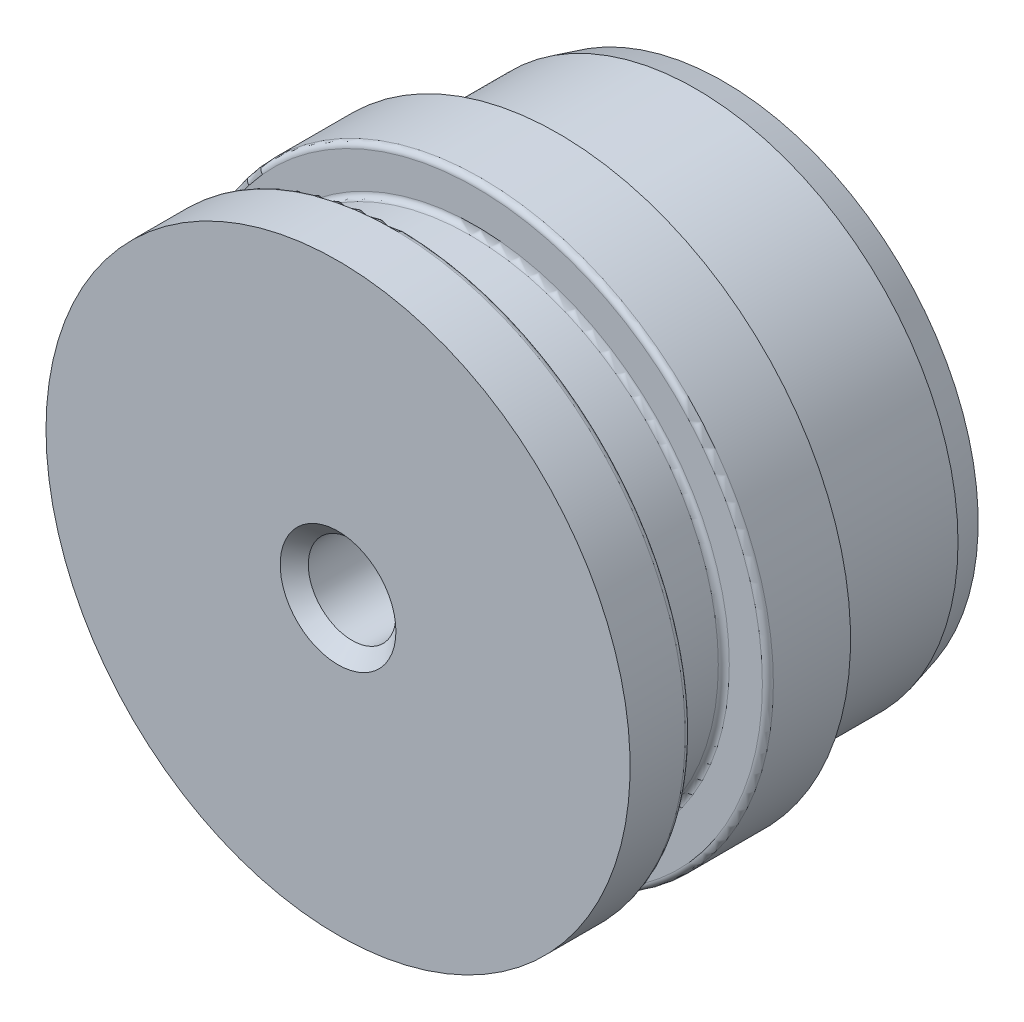
ISO-10303-21;
HEADER;
FILE_DESCRIPTION(('STEP AP214'),'2;1');
FILE_NAME('part.step','',(''),(''),'','','');
FILE_SCHEMA(('AUTOMOTIVE_DESIGN { 1 0 10303 214 1 1 1 1 }'));
ENDSEC;
DATA;
#1=APPLICATION_CONTEXT('core data for automotive mechanical design processes');
#2=APPLICATION_PROTOCOL_DEFINITION('international standard','automotive_design',2000,#1);
#3=PRODUCT_CONTEXT('',#1,'mechanical');
#4=PRODUCT('Part','Part','',(#3));
#5=PRODUCT_RELATED_PRODUCT_CATEGORY('part','',(#4));
#6=PRODUCT_DEFINITION_FORMATION('','',#4);
#7=PRODUCT_DEFINITION_CONTEXT('part definition',#1,'design');
#8=PRODUCT_DEFINITION('design','',#6,#7);
#9=PRODUCT_DEFINITION_SHAPE('','',#8);
#10=(LENGTH_UNIT() NAMED_UNIT(*) SI_UNIT(.MILLI.,.METRE.));
#11=(NAMED_UNIT(*) PLANE_ANGLE_UNIT() SI_UNIT($,.RADIAN.));
#12=(NAMED_UNIT(*) SI_UNIT($,.STERADIAN.) SOLID_ANGLE_UNIT());
#13=UNCERTAINTY_MEASURE_WITH_UNIT(LENGTH_MEASURE(1.E-05),#10,'distance_accuracy_value','');
#14=(GEOMETRIC_REPRESENTATION_CONTEXT(3) GLOBAL_UNCERTAINTY_ASSIGNED_CONTEXT((#13)) GLOBAL_UNIT_ASSIGNED_CONTEXT((#10,
#11,#12)) REPRESENTATION_CONTEXT('',''));
#15=CARTESIAN_POINT('',(0.,0.,0.));
#16=DIRECTION('',(0.,0.,1.));
#17=DIRECTION('',(1.,0.,0.));
#18=AXIS2_PLACEMENT_3D('',#15,#16,#17);
#19=CARTESIAN_POINT('',(0.,0.,-17.6438250742116));
#20=DIRECTION('',(0.,0.,1.));
#21=DIRECTION('',(1.,0.,0.));
#22=AXIS2_PLACEMENT_3D('',#19,#20,#21);
#23=CYLINDRICAL_SURFACE('',#22,2.0193);
#24=CARTESIAN_POINT('',(0.,0.,-0.647700000000004));
#25=DIRECTION('',(0.,0.,1.));
#26=DIRECTION('',(1.,0.,0.));
#27=AXIS2_PLACEMENT_3D('',#24,#25,#26);
#28=CIRCLE('',#27,2.0193);
#29=CARTESIAN_POINT('',(2.0193,0.,-0.647700000000004));
#30=VERTEX_POINT('',#29);
#31=EDGE_CURVE('E431',#30,#30,#28,.T.);
#32=ORIENTED_EDGE('',*,*,#31,.T.);
#33=EDGE_LOOP('',(#32));
#34=FACE_BOUND('',#33,.T.);
#35=CARTESIAN_POINT('',(0.,0.,-6.604));
#36=DIRECTION('',(0.,0.,1.));
#37=DIRECTION('',(1.,0.,0.));
#38=AXIS2_PLACEMENT_3D('',#35,#36,#37);
#39=CIRCLE('',#38,2.0193);
#40=CARTESIAN_POINT('',(2.0193,0.,-6.604));
#41=VERTEX_POINT('',#40);
#42=EDGE_CURVE('E436',#41,#41,#39,.T.);
#43=ORIENTED_EDGE('',*,*,#42,.F.);
#44=EDGE_LOOP('',(#43));
#45=FACE_BOUND('',#44,.T.);
#46=ADVANCED_FACE('F35',(#34,#45),#23,.F.);
#47=CARTESIAN_POINT('',(0.,5.5118,-12.192));
#48=DIRECTION('',(0.,0.,-1.));
#49=DIRECTION('',(-1.,0.,0.));
#50=AXIS2_PLACEMENT_3D('',#47,#48,#49);
#51=PLANE('',#50);
#52=CARTESIAN_POINT('',(0.,0.,-12.192));
#53=DIRECTION('',(0.,0.,-1.));
#54=DIRECTION('',(-1.,0.,0.));
#55=AXIS2_PLACEMENT_3D('',#52,#53,#54);
#56=CIRCLE('',#55,5.5118);
#57=CARTESIAN_POINT('',(-5.5118,0.,-12.192));
#58=VERTEX_POINT('',#57);
#59=EDGE_CURVE('E91',#58,#58,#56,.T.);
#60=ORIENTED_EDGE('',*,*,#59,.T.);
#61=EDGE_LOOP('',(#60));
#62=FACE_BOUND('',#61,.T.);
#63=CARTESIAN_POINT('',(0.,0.,-12.192));
#64=DIRECTION('',(0.,0.,-1.));
#65=DIRECTION('',(-1.,0.,0.));
#66=AXIS2_PLACEMENT_3D('',#63,#64,#65);
#67=CIRCLE('',#66,0.508000000000004);
#68=CARTESIAN_POINT('',(-0.508000000000004,0.,-12.192));
#69=VERTEX_POINT('',#68);
#70=EDGE_CURVE('E70',#69,#69,#67,.F.);
#71=ORIENTED_EDGE('',*,*,#70,.T.);
#72=EDGE_LOOP('',(#71));
#73=FACE_BOUND('',#72,.T.);
#74=ADVANCED_FACE('F142',(#62,#73),#51,.T.);
#75=CARTESIAN_POINT('',(0.,0.,0.));
#76=DIRECTION('',(0.,0.,1.));
#77=DIRECTION('',(1.,0.,0.));
#78=AXIS2_PLACEMENT_3D('',#75,#76,#77);
#79=PLANE('',#78);
#80=CARTESIAN_POINT('',(0.,0.,0.));
#81=DIRECTION('',(0.,0.,1.));
#82=DIRECTION('',(1.,0.,0.));
#83=AXIS2_PLACEMENT_3D('',#80,#81,#82);
#84=CIRCLE('',#83,2.667);
#85=CARTESIAN_POINT('',(2.667,0.,0.));
#86=VERTEX_POINT('',#85);
#87=EDGE_CURVE('E434',#86,#86,#84,.T.);
#88=ORIENTED_EDGE('',*,*,#87,.F.);
#89=EDGE_LOOP('',(#88));
#90=FACE_BOUND('',#89,.T.);
#91=CARTESIAN_POINT('',(0.,0.,0.));
#92=DIRECTION('',(0.,0.,-1.));
#93=DIRECTION('',(-1.,0.,0.));
#94=AXIS2_PLACEMENT_3D('',#91,#92,#93);
#95=CIRCLE('',#94,13.462);
#96=CARTESIAN_POINT('',(-13.462,0.,0.));
#97=VERTEX_POINT('',#96);
#98=EDGE_CURVE('E88',#97,#97,#95,.T.);
#99=ORIENTED_EDGE('',*,*,#98,.F.);
#100=EDGE_LOOP('',(#99));
#101=FACE_BOUND('',#100,.T.);
#102=ADVANCED_FACE('F148',(#90,#101),#79,.T.);
#103=CARTESIAN_POINT('',(0.,0.,-12.192));
#104=DIRECTION('',(0.,0.,-1.));
#105=DIRECTION('',(-1.,0.,0.));
#106=AXIS2_PLACEMENT_3D('',#103,#104,#105);
#107=CYLINDRICAL_SURFACE('',#106,12.065);
#108=CARTESIAN_POINT('',(0.,0.,-16.51));
#109=DIRECTION('',(0.,0.,-1.));
#110=DIRECTION('',(-1.,0.,0.));
#111=AXIS2_PLACEMENT_3D('',#108,#109,#110);
#112=CIRCLE('',#111,12.065);
#113=CARTESIAN_POINT('',(-12.065,0.,-16.51));
#114=VERTEX_POINT('',#113);
#115=EDGE_CURVE('E11',#114,#114,#112,.F.);
#116=ORIENTED_EDGE('',*,*,#115,.T.);
#117=EDGE_LOOP('',(#116));
#118=FACE_BOUND('',#117,.T.);
#119=CARTESIAN_POINT('',(0.,0.,-10.16));
#120=DIRECTION('',(0.,0.,-1.));
#121=DIRECTION('',(-1.,0.,0.));
#122=AXIS2_PLACEMENT_3D('',#119,#120,#121);
#123=CIRCLE('',#122,12.065);
#124=CARTESIAN_POINT('',(-12.065,0.,-10.16));
#125=VERTEX_POINT('',#124);
#126=EDGE_CURVE('E82',#125,#125,#123,.T.);
#127=ORIENTED_EDGE('',*,*,#126,.T.);
#128=EDGE_LOOP('',(#127));
#129=FACE_BOUND('',#128,.T.);
#130=ADVANCED_FACE('F218',(#118,#129),#107,.T.);
#131=CARTESIAN_POINT('',(0.,12.065,-17.78));
#132=DIRECTION('',(0.,0.,-1.));
#133=DIRECTION('',(-1.,0.,0.));
#134=AXIS2_PLACEMENT_3D('',#131,#132,#133);
#135=PLANE('',#134);
#136=CARTESIAN_POINT('',(0.,0.,-17.78));
#137=DIRECTION('',(0.,0.,-1.));
#138=DIRECTION('',(-1.,0.,0.));
#139=AXIS2_PLACEMENT_3D('',#136,#137,#138);
#140=CIRCLE('',#139,11.7247045256125);
#141=CARTESIAN_POINT('',(-11.7247045256125,0.,-17.78));
#142=VERTEX_POINT('',#141);
#143=EDGE_CURVE('E43',#142,#142,#140,.T.);
#144=ORIENTED_EDGE('',*,*,#143,.T.);
#145=EDGE_LOOP('',(#144));
#146=FACE_BOUND('',#145,.T.);
#147=CARTESIAN_POINT('',(0.,0.,-17.78));
#148=DIRECTION('',(0.,0.,-1.));
#149=DIRECTION('',(-1.,0.,0.));
#150=AXIS2_PLACEMENT_3D('',#147,#148,#149);
#151=CIRCLE('',#150,5.97404219751809);
#152=CARTESIAN_POINT('',(-5.97404219751809,0.,-17.78));
#153=VERTEX_POINT('',#152);
#154=EDGE_CURVE('E97',#153,#153,#151,.F.);
#155=ORIENTED_EDGE('',*,*,#154,.T.);
#156=EDGE_LOOP('',(#155));
#157=FACE_BOUND('',#156,.T.);
#158=CARTESIAN_POINT('',(7.14903970824054,4.1275,-17.78));
#159=DIRECTION('',(0.,0.,-1.));
#160=DIRECTION('',(-1.,0.,0.));
#161=AXIS2_PLACEMENT_3D('',#158,#159,#160);
#162=CIRCLE('',#161,1.35255);
#163=CARTESIAN_POINT('',(5.79648970824054,4.1275,-17.78));
#164=VERTEX_POINT('',#163);
#165=EDGE_CURVE('E64',#164,#164,#162,.T.);
#166=ORIENTED_EDGE('',*,*,#165,.F.);
#167=EDGE_LOOP('',(#166));
#168=FACE_BOUND('',#167,.T.);
#169=CARTESIAN_POINT('',(0.,-8.255,-17.78));
#170=DIRECTION('',(0.,0.,-1.));
#171=DIRECTION('',(-1.,0.,0.));
#172=AXIS2_PLACEMENT_3D('',#169,#170,#171);
#173=CIRCLE('',#172,1.35255);
#174=CARTESIAN_POINT('',(-1.35255,-8.255,-17.78));
#175=VERTEX_POINT('',#174);
#176=EDGE_CURVE('E63',#175,#175,#173,.T.);
#177=ORIENTED_EDGE('',*,*,#176,.F.);
#178=EDGE_LOOP('',(#177));
#179=FACE_BOUND('',#178,.T.);
#180=CARTESIAN_POINT('',(-7.14903970824054,4.1275,-17.78));
#181=DIRECTION('',(0.,0.,-1.));
#182=DIRECTION('',(-1.,0.,0.));
#183=AXIS2_PLACEMENT_3D('',#180,#181,#182);
#184=CIRCLE('',#183,1.35255);
#185=CARTESIAN_POINT('',(-8.50158970824054,4.1275,-17.78));
#186=VERTEX_POINT('',#185);
#187=EDGE_CURVE('E76',#186,#186,#184,.T.);
#188=ORIENTED_EDGE('',*,*,#187,.F.);
#189=EDGE_LOOP('',(#188));
#190=FACE_BOUND('',#189,.T.);
#191=ADVANCED_FACE('F129',(#146,#157,#168,#179,#190),#135,.T.);
#192=CARTESIAN_POINT('',(0.,0.,-12.192));
#193=DIRECTION('',(0.,0.,-1.));
#194=DIRECTION('',(-1.,0.,0.));
#195=AXIS2_PLACEMENT_3D('',#192,#193,#194);
#196=CYLINDRICAL_SURFACE('',#195,5.5118);
#197=CARTESIAN_POINT('',(0.,0.,-16.51));
#198=DIRECTION('',(0.,0.,-1.));
#199=DIRECTION('',(-1.,0.,0.));
#200=AXIS2_PLACEMENT_3D('',#197,#198,#199);
#201=CIRCLE('',#200,5.5118);
#202=CARTESIAN_POINT('',(-5.5118,0.,-16.51));
#203=VERTEX_POINT('',#202);
#204=EDGE_CURVE('E94',#203,#203,#201,.T.);
#205=ORIENTED_EDGE('',*,*,#204,.T.);
#206=EDGE_LOOP('',(#205));
#207=FACE_BOUND('',#206,.T.);
#208=ORIENTED_EDGE('',*,*,#59,.F.);
#209=EDGE_LOOP('',(#208));
#210=FACE_BOUND('',#209,.T.);
#211=ADVANCED_FACE('F215',(#207,#210),#196,.F.);
#212=CARTESIAN_POINT('',(0.,0.,-12.192));
#213=DIRECTION('',(0.,0.,-1.));
#214=DIRECTION('',(-1.,0.,0.));
#215=AXIS2_PLACEMENT_3D('',#212,#213,#214);
#216=CYLINDRICAL_SURFACE('',#215,13.462);
#217=CARTESIAN_POINT('',(0.,0.,-2.54));
#218=DIRECTION('',(0.,0.,-1.));
#219=DIRECTION('',(-1.,0.,0.));
#220=AXIS2_PLACEMENT_3D('',#217,#218,#219);
#221=CIRCLE('',#220,13.462);
#222=CARTESIAN_POINT('',(-13.462,0.,-2.54));
#223=VERTEX_POINT('',#222);
#224=EDGE_CURVE('E118',#223,#223,#221,.F.);
#225=ORIENTED_EDGE('',*,*,#224,.T.);
#226=EDGE_LOOP('',(#225));
#227=FACE_BOUND('',#226,.T.);
#228=ORIENTED_EDGE('',*,*,#98,.T.);
#229=EDGE_LOOP('',(#228));
#230=FACE_BOUND('',#229,.T.);
#231=ADVANCED_FACE('F211',(#227,#230),#216,.T.);
#232=CARTESIAN_POINT('',(0.,13.462,-2.794));
#233=DIRECTION('',(0.,0.,-1.));
#234=DIRECTION('',(-1.,0.,0.));
#235=AXIS2_PLACEMENT_3D('',#232,#233,#234);
#236=PLANE('',#235);
#237=CARTESIAN_POINT('',(0.,0.,-2.794));
#238=DIRECTION('',(0.,0.,-1.));
#239=DIRECTION('',(-1.,0.,0.));
#240=AXIS2_PLACEMENT_3D('',#237,#238,#239);
#241=CIRCLE('',#240,13.208);
#242=CARTESIAN_POINT('',(-13.208,0.,-2.794));
#243=VERTEX_POINT('',#242);
#244=EDGE_CURVE('E115',#243,#243,#241,.T.);
#245=ORIENTED_EDGE('',*,*,#244,.T.);
#246=EDGE_LOOP('',(#245));
#247=FACE_BOUND('',#246,.T.);
#248=CARTESIAN_POINT('',(0.,0.,-2.794));
#249=DIRECTION('',(0.,0.,-1.));
#250=DIRECTION('',(-1.,0.,0.));
#251=AXIS2_PLACEMENT_3D('',#248,#249,#250);
#252=CIRCLE('',#251,11.684);
#253=CARTESIAN_POINT('',(-11.684,0.,-2.794));
#254=VERTEX_POINT('',#253);
#255=EDGE_CURVE('E112',#254,#254,#252,.F.);
#256=ORIENTED_EDGE('',*,*,#255,.T.);
#257=EDGE_LOOP('',(#256));
#258=FACE_BOUND('',#257,.T.);
#259=ADVANCED_FACE('F207',(#247,#258),#236,.T.);
#260=CARTESIAN_POINT('',(0.,0.,-12.192));
#261=DIRECTION('',(0.,0.,-1.));
#262=DIRECTION('',(-1.,0.,0.));
#263=AXIS2_PLACEMENT_3D('',#260,#261,#262);
#264=CYLINDRICAL_SURFACE('',#263,11.43);
#265=CARTESIAN_POINT('',(0.,0.,-3.048));
#266=DIRECTION('',(0.,0.,-1.));
#267=DIRECTION('',(-1.,0.,0.));
#268=AXIS2_PLACEMENT_3D('',#265,#266,#267);
#269=CIRCLE('',#268,11.43);
#270=CARTESIAN_POINT('',(-11.43,0.,-3.048));
#271=VERTEX_POINT('',#270);
#272=EDGE_CURVE('E124',#271,#271,#269,.T.);
#273=ORIENTED_EDGE('',*,*,#272,.T.);
#274=EDGE_LOOP('',(#273));
#275=FACE_BOUND('',#274,.T.);
#276=CARTESIAN_POINT('',(0.,0.,-6.096));
#277=DIRECTION('',(0.,0.,1.));
#278=DIRECTION('',(1.,0.,0.));
#279=AXIS2_PLACEMENT_3D('',#276,#277,#278);
#280=CIRCLE('',#279,11.43);
#281=CARTESIAN_POINT('',(11.43,0.,-6.096));
#282=VERTEX_POINT('',#281);
#283=EDGE_CURVE('E121',#282,#282,#280,.T.);
#284=ORIENTED_EDGE('',*,*,#283,.T.);
#285=EDGE_LOOP('',(#284));
#286=FACE_BOUND('',#285,.T.);
#287=ADVANCED_FACE('F203',(#275,#286),#264,.T.);
#288=CARTESIAN_POINT('',(0.,11.43,-6.35));
#289=DIRECTION('',(0.,0.,1.));
#290=DIRECTION('',(1.,0.,0.));
#291=AXIS2_PLACEMENT_3D('',#288,#289,#290);
#292=PLANE('',#291);
#293=CARTESIAN_POINT('',(0.,0.,-6.35));
#294=DIRECTION('',(0.,0.,1.));
#295=DIRECTION('',(1.,0.,0.));
#296=AXIS2_PLACEMENT_3D('',#293,#294,#295);
#297=CIRCLE('',#296,13.208);
#298=CARTESIAN_POINT('',(13.208,0.,-6.35));
#299=VERTEX_POINT('',#298);
#300=EDGE_CURVE('E109',#299,#299,#297,.T.);
#301=ORIENTED_EDGE('',*,*,#300,.T.);
#302=EDGE_LOOP('',(#301));
#303=FACE_BOUND('',#302,.T.);
#304=CARTESIAN_POINT('',(0.,0.,-6.35));
#305=DIRECTION('',(0.,0.,1.));
#306=DIRECTION('',(1.,0.,0.));
#307=AXIS2_PLACEMENT_3D('',#304,#305,#306);
#308=CIRCLE('',#307,11.684);
#309=CARTESIAN_POINT('',(11.684,0.,-6.35));
#310=VERTEX_POINT('',#309);
#311=EDGE_CURVE('E106',#310,#310,#308,.F.);
#312=ORIENTED_EDGE('',*,*,#311,.T.);
#313=EDGE_LOOP('',(#312));
#314=FACE_BOUND('',#313,.T.);
#315=ADVANCED_FACE('F199',(#303,#314),#292,.T.);
#316=CARTESIAN_POINT('',(0.,0.,-12.192));
#317=DIRECTION('',(0.,0.,-1.));
#318=DIRECTION('',(-1.,0.,0.));
#319=AXIS2_PLACEMENT_3D('',#316,#317,#318);
#320=CYLINDRICAL_SURFACE('',#319,13.462);
#321=CARTESIAN_POINT('',(0.,0.,-6.604));
#322=DIRECTION('',(0.,0.,1.));
#323=DIRECTION('',(1.,0.,0.));
#324=AXIS2_PLACEMENT_3D('',#321,#322,#323);
#325=CIRCLE('',#324,13.462);
#326=CARTESIAN_POINT('',(13.462,0.,-6.604));
#327=VERTEX_POINT('',#326);
#328=EDGE_CURVE('E100',#327,#327,#325,.F.);
#329=ORIENTED_EDGE('',*,*,#328,.T.);
#330=EDGE_LOOP('',(#329));
#331=FACE_BOUND('',#330,.T.);
#332=CARTESIAN_POINT('',(0.,0.,-10.16));
#333=DIRECTION('',(0.,0.,-1.));
#334=DIRECTION('',(-1.,0.,0.));
#335=AXIS2_PLACEMENT_3D('',#332,#333,#334);
#336=CIRCLE('',#335,13.462);
#337=CARTESIAN_POINT('',(-13.462,0.,-10.16));
#338=VERTEX_POINT('',#337);
#339=EDGE_CURVE('E85',#338,#338,#336,.T.);
#340=ORIENTED_EDGE('',*,*,#339,.F.);
#341=EDGE_LOOP('',(#340));
#342=FACE_BOUND('',#341,.T.);
#343=ADVANCED_FACE('F195',(#331,#342),#320,.T.);
#344=CARTESIAN_POINT('',(0.,13.462,-10.16));
#345=DIRECTION('',(0.,0.,-1.));
#346=DIRECTION('',(-1.,0.,0.));
#347=AXIS2_PLACEMENT_3D('',#344,#345,#346);
#348=PLANE('',#347);
#349=ORIENTED_EDGE('',*,*,#339,.T.);
#350=EDGE_LOOP('',(#349));
#351=FACE_BOUND('',#350,.T.);
#352=ORIENTED_EDGE('',*,*,#126,.F.);
#353=EDGE_LOOP('',(#352));
#354=FACE_BOUND('',#353,.T.);
#355=ADVANCED_FACE('F192',(#351,#354),#348,.T.);
#356=CARTESIAN_POINT('',(-7.14903970824054,4.1275,-8.382));
#357=DIRECTION('',(0.,0.,-1.));
#358=DIRECTION('',(-1.,0.,0.));
#359=AXIS2_PLACEMENT_3D('',#356,#357,#358);
#360=CONICAL_SURFACE('',#359,1.35255,1.02974425867665);
#361=CARTESIAN_POINT('',(-7.14903970824054,4.1275,-7.56930596973427));
#362=VERTEX_POINT('',#361);
#363=VERTEX_LOOP('',#362);
#364=FACE_BOUND('',#363,.T.);
#365=CARTESIAN_POINT('',(-7.14903970824054,4.1275,-8.382));
#366=DIRECTION('',(0.,0.,-1.));
#367=DIRECTION('',(-1.,0.,0.));
#368=AXIS2_PLACEMENT_3D('',#365,#366,#367);
#369=CIRCLE('',#368,1.35255);
#370=CARTESIAN_POINT('',(-8.50158970824054,4.1275,-8.382));
#371=VERTEX_POINT('',#370);
#372=EDGE_CURVE('E79',#371,#371,#369,.T.);
#373=ORIENTED_EDGE('',*,*,#372,.T.);
#374=EDGE_LOOP('',(#373));
#375=FACE_BOUND('',#374,.T.);
#376=ADVANCED_FACE('F188',(#364,#375),#360,.F.);
#377=CARTESIAN_POINT('',(-7.14903970824054,4.1275,-17.78));
#378=DIRECTION('',(0.,0.,-1.));
#379=DIRECTION('',(-1.,0.,0.));
#380=AXIS2_PLACEMENT_3D('',#377,#378,#379);
#381=CYLINDRICAL_SURFACE('',#380,1.35255);
#382=ORIENTED_EDGE('',*,*,#372,.F.);
#383=EDGE_LOOP('',(#382));
#384=FACE_BOUND('',#383,.T.);
#385=ORIENTED_EDGE('',*,*,#187,.T.);
#386=EDGE_LOOP('',(#385));
#387=FACE_BOUND('',#386,.T.);
#388=ADVANCED_FACE('F185',(#384,#387),#381,.F.);
#389=CARTESIAN_POINT('',(0.,-8.255,-8.382));
#390=DIRECTION('',(0.,0.,-1.));
#391=DIRECTION('',(-1.,0.,0.));
#392=AXIS2_PLACEMENT_3D('',#389,#390,#391);
#393=CONICAL_SURFACE('',#392,1.35255,1.02974425867665);
#394=CARTESIAN_POINT('',(0.,-8.255,-7.56930596973427));
#395=VERTEX_POINT('',#394);
#396=VERTEX_LOOP('',#395);
#397=FACE_BOUND('',#396,.T.);
#398=CARTESIAN_POINT('',(0.,-8.255,-8.382));
#399=DIRECTION('',(0.,0.,-1.));
#400=DIRECTION('',(-1.,0.,0.));
#401=AXIS2_PLACEMENT_3D('',#398,#399,#400);
#402=CIRCLE('',#401,1.35255);
#403=CARTESIAN_POINT('',(-1.35255,-8.255,-8.382));
#404=VERTEX_POINT('',#403);
#405=EDGE_CURVE('E67',#404,#404,#402,.T.);
#406=ORIENTED_EDGE('',*,*,#405,.T.);
#407=EDGE_LOOP('',(#406));
#408=FACE_BOUND('',#407,.T.);
#409=ADVANCED_FACE('F181',(#397,#408),#393,.F.);
#410=CARTESIAN_POINT('',(0.,-8.255,-17.78));
#411=DIRECTION('',(0.,0.,-1.));
#412=DIRECTION('',(-1.,0.,0.));
#413=AXIS2_PLACEMENT_3D('',#410,#411,#412);
#414=CYLINDRICAL_SURFACE('',#413,1.35255);
#415=ORIENTED_EDGE('',*,*,#405,.F.);
#416=EDGE_LOOP('',(#415));
#417=FACE_BOUND('',#416,.T.);
#418=ORIENTED_EDGE('',*,*,#176,.T.);
#419=EDGE_LOOP('',(#418));
#420=FACE_BOUND('',#419,.T.);
#421=ADVANCED_FACE('F57',(#417,#420),#414,.F.);
#422=CARTESIAN_POINT('',(7.14903970824054,4.1275,-8.382));
#423=DIRECTION('',(0.,0.,-1.));
#424=DIRECTION('',(-1.,0.,0.));
#425=AXIS2_PLACEMENT_3D('',#422,#423,#424);
#426=CONICAL_SURFACE('',#425,1.35255,1.02974425867665);
#427=CARTESIAN_POINT('',(7.14903970824054,4.1275,-7.56930596973427));
#428=VERTEX_POINT('',#427);
#429=VERTEX_LOOP('',#428);
#430=FACE_BOUND('',#429,.T.);
#431=CARTESIAN_POINT('',(7.14903970824054,4.1275,-8.382));
#432=DIRECTION('',(0.,0.,-1.));
#433=DIRECTION('',(-1.,0.,0.));
#434=AXIS2_PLACEMENT_3D('',#431,#432,#433);
#435=CIRCLE('',#434,1.35255);
#436=CARTESIAN_POINT('',(5.79648970824055,4.1275,-8.382));
#437=VERTEX_POINT('',#436);
#438=EDGE_CURVE('E61',#437,#437,#435,.T.);
#439=ORIENTED_EDGE('',*,*,#438,.T.);
#440=EDGE_LOOP('',(#439));
#441=FACE_BOUND('',#440,.T.);
#442=ADVANCED_FACE('F53',(#430,#441),#426,.F.);
#443=CARTESIAN_POINT('',(7.14903970824054,4.1275,-17.78));
#444=DIRECTION('',(0.,0.,-1.));
#445=DIRECTION('',(-1.,0.,0.));
#446=AXIS2_PLACEMENT_3D('',#443,#444,#445);
#447=CYLINDRICAL_SURFACE('',#446,1.35255);
#448=ORIENTED_EDGE('',*,*,#438,.F.);
#449=EDGE_LOOP('',(#448));
#450=FACE_BOUND('',#449,.T.);
#451=ORIENTED_EDGE('',*,*,#165,.T.);
#452=EDGE_LOOP('',(#451));
#453=FACE_BOUND('',#452,.T.);
#454=ADVANCED_FACE('F56',(#450,#453),#447,.F.);
#455=CARTESIAN_POINT('',(0.,0.,-16.51));
#456=DIRECTION('',(0.,0.,-1.));
#457=DIRECTION('',(-1.,0.,0.));
#458=AXIS2_PLACEMENT_3D('',#455,#456,#457);
#459=CONICAL_SURFACE('',#458,5.5118,0.349065850398873);
#460=ORIENTED_EDGE('',*,*,#154,.F.);
#461=EDGE_LOOP('',(#460));
#462=FACE_BOUND('',#461,.T.);
#463=ORIENTED_EDGE('',*,*,#204,.F.);
#464=EDGE_LOOP('',(#463));
#465=FACE_BOUND('',#464,.T.);
#466=ADVANCED_FACE('F175',(#462,#465),#459,.F.);
#467=CARTESIAN_POINT('',(0.,0.,-17.6438250742116));
#468=DIRECTION('',(0.,0.,1.));
#469=DIRECTION('',(1.,0.,0.));
#470=AXIS2_PLACEMENT_3D('',#467,#468,#469);
#471=CYLINDRICAL_SURFACE('',#470,0.508000000000004);
#472=ORIENTED_EDGE('',*,*,#70,.F.);
#473=EDGE_LOOP('',(#472));
#474=FACE_BOUND('',#473,.T.);
#475=CARTESIAN_POINT('',(0.,0.,-10.414));
#476=DIRECTION('',(0.,0.,1.));
#477=DIRECTION('',(1.,0.,0.));
#478=AXIS2_PLACEMENT_3D('',#475,#476,#477);
#479=CIRCLE('',#478,0.508000000000003);
#480=CARTESIAN_POINT('',(0.508000000000003,0.,-10.414));
#481=VERTEX_POINT('',#480);
#482=EDGE_CURVE('E103',#481,#481,#479,.T.);
#483=ORIENTED_EDGE('',*,*,#482,.T.);
#484=EDGE_LOOP('',(#483));
#485=FACE_BOUND('',#484,.T.);
#486=ADVANCED_FACE('F171',(#474,#485),#471,.F.);
#487=CARTESIAN_POINT('',(0.,0.850900000000003,-10.414));
#488=DIRECTION('',(0.,0.,1.));
#489=DIRECTION('',(1.,0.,0.));
#490=AXIS2_PLACEMENT_3D('',#487,#488,#489);
#491=PLANE('',#490);
#492=CARTESIAN_POINT('',(0.,0.,-10.414));
#493=DIRECTION('',(0.,0.,1.));
#494=DIRECTION('',(1.,0.,0.));
#495=AXIS2_PLACEMENT_3D('',#492,#493,#494);
#496=CIRCLE('',#495,0.850900000000003);
#497=CARTESIAN_POINT('',(0.850900000000003,0.,-10.414));
#498=VERTEX_POINT('',#497);
#499=EDGE_CURVE('E447',#498,#498,#496,.T.);
#500=ORIENTED_EDGE('',*,*,#499,.T.);
#501=EDGE_LOOP('',(#500));
#502=FACE_BOUND('',#501,.T.);
#503=ORIENTED_EDGE('',*,*,#482,.F.);
#504=EDGE_LOOP('',(#503));
#505=FACE_BOUND('',#504,.T.);
#506=ADVANCED_FACE('F167',(#502,#505),#491,.T.);
#507=CARTESIAN_POINT('',(0.,0.,-17.6438250742116));
#508=DIRECTION('',(0.,0.,1.));
#509=DIRECTION('',(1.,0.,0.));
#510=AXIS2_PLACEMENT_3D('',#507,#508,#509);
#511=CYLINDRICAL_SURFACE('',#510,0.850900000000001);
#512=CARTESIAN_POINT('',(0.,0.,-8.5322768408187));
#513=DIRECTION('',(0.,0.,1.));
#514=DIRECTION('',(1.,0.,0.));
#515=AXIS2_PLACEMENT_3D('',#512,#513,#514);
#516=CIRCLE('',#515,0.8509);
#517=CARTESIAN_POINT('',(0.8509,0.,-8.5322768408187));
#518=VERTEX_POINT('',#517);
#519=EDGE_CURVE('E444',#518,#518,#516,.T.);
#520=ORIENTED_EDGE('',*,*,#519,.T.);
#521=EDGE_LOOP('',(#520));
#522=FACE_BOUND('',#521,.T.);
#523=ORIENTED_EDGE('',*,*,#499,.F.);
#524=EDGE_LOOP('',(#523));
#525=FACE_BOUND('',#524,.T.);
#526=ADVANCED_FACE('F163',(#522,#525),#511,.F.);
#527=CARTESIAN_POINT('',(0.,0.,-8.5322768408187));
#528=DIRECTION('',(0.,0.,1.));
#529=DIRECTION('',(1.,0.,0.));
#530=AXIS2_PLACEMENT_3D('',#527,#528,#529);
#531=CONICAL_SURFACE('',#530,0.8509,0.349065850398859);
#532=CARTESIAN_POINT('',(0.,0.,-6.96281051157985));
#533=DIRECTION('',(0.,0.,1.));
#534=DIRECTION('',(1.,0.,0.));
#535=AXIS2_PLACEMENT_3D('',#532,#533,#534);
#536=CIRCLE('',#535,1.42213902752597);
#537=CARTESIAN_POINT('',(1.42213902752597,0.,-6.96281051157985));
#538=VERTEX_POINT('',#537);
#539=EDGE_CURVE('E441',#538,#538,#536,.T.);
#540=ORIENTED_EDGE('',*,*,#539,.T.);
#541=EDGE_LOOP('',(#540));
#542=FACE_BOUND('',#541,.T.);
#543=ORIENTED_EDGE('',*,*,#519,.F.);
#544=EDGE_LOOP('',(#543));
#545=FACE_BOUND('',#544,.T.);
#546=ADVANCED_FACE('F159',(#542,#545),#531,.F.);
#547=CARTESIAN_POINT('',(0.,0.,-6.96281051157985));
#548=DIRECTION('',(0.,0.,1.));
#549=DIRECTION('',(1.,0.,0.));
#550=AXIS2_PLACEMENT_3D('',#547,#548,#549);
#551=CONICAL_SURFACE('',#550,1.42213902752597,1.02974425867665);
#552=ORIENTED_EDGE('',*,*,#42,.T.);
#553=EDGE_LOOP('',(#552));
#554=FACE_BOUND('',#553,.T.);
#555=ORIENTED_EDGE('',*,*,#539,.F.);
#556=EDGE_LOOP('',(#555));
#557=FACE_BOUND('',#556,.T.);
#558=ADVANCED_FACE('F156',(#554,#557),#551,.F.);
#559=CARTESIAN_POINT('',(0.,0.,0.));
#560=DIRECTION('',(0.,0.,1.));
#561=DIRECTION('',(1.,0.,0.));
#562=AXIS2_PLACEMENT_3D('',#559,#560,#561);
#563=CONICAL_SURFACE('',#562,2.667,0.785398163397446);
#564=ORIENTED_EDGE('',*,*,#31,.F.);
#565=EDGE_LOOP('',(#564));
#566=FACE_BOUND('',#565,.T.);
#567=ORIENTED_EDGE('',*,*,#87,.T.);
#568=EDGE_LOOP('',(#567));
#569=FACE_BOUND('',#568,.T.);
#570=ADVANCED_FACE('F155',(#566,#569),#563,.F.);
#571=CARTESIAN_POINT('',(0.,0.,-6.604));
#572=DIRECTION('',(0.,0.,1.));
#573=DIRECTION('',(1.,0.,0.));
#574=AXIS2_PLACEMENT_3D('',#571,#572,#573);
#575=TOROIDAL_SURFACE('',#574,13.208,0.254);
#576=ORIENTED_EDGE('',*,*,#300,.F.);
#577=EDGE_LOOP('',(#576));
#578=FACE_BOUND('',#577,.T.);
#579=ORIENTED_EDGE('',*,*,#328,.F.);
#580=EDGE_LOOP('',(#579));
#581=FACE_BOUND('',#580,.T.);
#582=ADVANCED_FACE('F232',(#578,#581),#575,.T.);
#583=CARTESIAN_POINT('',(0.,0.,-2.54));
#584=DIRECTION('',(0.,0.,-1.));
#585=DIRECTION('',(-1.,0.,0.));
#586=AXIS2_PLACEMENT_3D('',#583,#584,#585);
#587=TOROIDAL_SURFACE('',#586,13.208,0.254);
#588=ORIENTED_EDGE('',*,*,#224,.F.);
#589=EDGE_LOOP('',(#588));
#590=FACE_BOUND('',#589,.T.);
#591=ORIENTED_EDGE('',*,*,#244,.F.);
#592=EDGE_LOOP('',(#591));
#593=FACE_BOUND('',#592,.T.);
#594=ADVANCED_FACE('F235',(#590,#593),#587,.T.);
#595=CARTESIAN_POINT('',(0.,0.,-3.048));
#596=DIRECTION('',(0.,0.,-1.));
#597=DIRECTION('',(-1.,0.,0.));
#598=AXIS2_PLACEMENT_3D('',#595,#596,#597);
#599=TOROIDAL_SURFACE('',#598,11.684,0.254);
#600=ORIENTED_EDGE('',*,*,#255,.F.);
#601=EDGE_LOOP('',(#600));
#602=FACE_BOUND('',#601,.T.);
#603=ORIENTED_EDGE('',*,*,#272,.F.);
#604=EDGE_LOOP('',(#603));
#605=FACE_BOUND('',#604,.T.);
#606=ADVANCED_FACE('F138',(#602,#605),#599,.F.);
#607=CARTESIAN_POINT('',(0.,0.,-6.096));
#608=DIRECTION('',(0.,0.,1.));
#609=DIRECTION('',(1.,0.,0.));
#610=AXIS2_PLACEMENT_3D('',#607,#608,#609);
#611=TOROIDAL_SURFACE('',#610,11.684,0.254);
#612=ORIENTED_EDGE('',*,*,#283,.F.);
#613=EDGE_LOOP('',(#612));
#614=FACE_BOUND('',#613,.T.);
#615=ORIENTED_EDGE('',*,*,#311,.F.);
#616=EDGE_LOOP('',(#615));
#617=FACE_BOUND('',#616,.T.);
#618=ADVANCED_FACE('F133',(#614,#617),#611,.F.);
#619=CARTESIAN_POINT('',(0.,0.,-17.78));
#620=DIRECTION('',(0.,0.,1.));
#621=DIRECTION('',(1.,0.,0.));
#622=AXIS2_PLACEMENT_3D('',#619,#620,#621);
#623=CONICAL_SURFACE('',#622,11.7247045256125,0.261799387799147);
#624=ORIENTED_EDGE('',*,*,#115,.F.);
#625=EDGE_LOOP('',(#624));
#626=FACE_BOUND('',#625,.T.);
#627=ORIENTED_EDGE('',*,*,#143,.F.);
#628=EDGE_LOOP('',(#627));
#629=FACE_BOUND('',#628,.T.);
#630=ADVANCED_FACE('F37',(#626,#629),#623,.T.);
#631=CLOSED_SHELL('',(#46,#74,#102,#130,#191,#211,#231,#259,#287,#315,#343,#355,#376,#388,#409,
#421,#442,#454,#466,#486,#506,#526,#546,#558,#570,#582,#594,#606,#618,#630));
#632=MANIFOLD_SOLID_BREP('B2',#631);
#633=ADVANCED_BREP_SHAPE_REPRESENTATION('',(#18,#632),#14);
#634=SHAPE_DEFINITION_REPRESENTATION(#9,#633);
ENDSEC;
END-ISO-10303-21;
